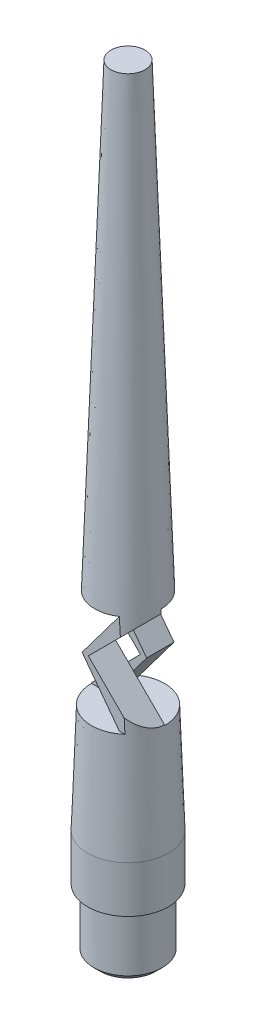
ISO-10303-21;
HEADER;
FILE_DESCRIPTION(('STEP AP214'),'2;1');
FILE_NAME('part.step','',(''),(''),'','','');
FILE_SCHEMA(('AUTOMOTIVE_DESIGN { 1 0 10303 214 1 1 1 1 }'));
ENDSEC;
DATA;
#1=APPLICATION_CONTEXT('core data for automotive mechanical design processes');
#2=APPLICATION_PROTOCOL_DEFINITION('international standard','automotive_design',2000,#1);
#3=PRODUCT_CONTEXT('',#1,'mechanical');
#4=PRODUCT('Part','Part','',(#3));
#5=PRODUCT_RELATED_PRODUCT_CATEGORY('part','',(#4));
#6=PRODUCT_DEFINITION_FORMATION('','',#4);
#7=PRODUCT_DEFINITION_CONTEXT('part definition',#1,'design');
#8=PRODUCT_DEFINITION('design','',#6,#7);
#9=PRODUCT_DEFINITION_SHAPE('','',#8);
#10=(LENGTH_UNIT() NAMED_UNIT(*) SI_UNIT(.MILLI.,.METRE.));
#11=(NAMED_UNIT(*) PLANE_ANGLE_UNIT() SI_UNIT($,.RADIAN.));
#12=(NAMED_UNIT(*) SI_UNIT($,.STERADIAN.) SOLID_ANGLE_UNIT());
#13=UNCERTAINTY_MEASURE_WITH_UNIT(LENGTH_MEASURE(1.E-05),#10,'distance_accuracy_value','');
#14=(GEOMETRIC_REPRESENTATION_CONTEXT(3) GLOBAL_UNCERTAINTY_ASSIGNED_CONTEXT((#13)) GLOBAL_UNIT_ASSIGNED_CONTEXT((#10,
#11,#12)) REPRESENTATION_CONTEXT('',''));
#15=CARTESIAN_POINT('',(0.,0.,0.));
#16=DIRECTION('',(0.,0.,1.));
#17=DIRECTION('',(1.,0.,0.));
#18=AXIS2_PLACEMENT_3D('',#15,#16,#17);
#19=CARTESIAN_POINT('',(0.,31.75,0.));
#20=DIRECTION('',(0.,-1.,0.));
#21=DIRECTION('',(0.,0.,-1.));
#22=AXIS2_PLACEMENT_3D('',#19,#20,#21);
#23=CONICAL_SURFACE('',#22,0.697488389028024,0.0349065850398794);
#24=CARTESIAN_POINT('',(0.,31.75,0.));
#25=DIRECTION('',(0.,-1.,0.));
#26=DIRECTION('',(0.,0.,-1.));
#27=AXIS2_PLACEMENT_3D('',#24,#25,#26);
#28=CIRCLE('',#27,0.697488389028024);
#29=CARTESIAN_POINT('',(0.,31.75,-0.697488389028024));
#30=VERTEX_POINT('',#29);
#31=EDGE_CURVE('E278',#30,#30,#28,.T.);
#32=ORIENTED_EDGE('',*,*,#31,.T.);
#33=EDGE_LOOP('',(#32));
#34=FACE_BOUND('',#33,.T.);
#35=CARTESIAN_POINT('',(0.,12.954,0.));
#36=DIRECTION('',(0.,-1.,0.));
#37=DIRECTION('',(0.,0.,-1.));
#38=AXIS2_PLACEMENT_3D('',#35,#36,#37);
#39=CIRCLE('',#38,1.35385917239478);
#40=CARTESIAN_POINT('',(0.762000000000001,12.954,1.11905793356621));
#41=VERTEX_POINT('',#40);
#42=CARTESIAN_POINT('',(-1.35385917239478,12.954,0.));
#43=VERTEX_POINT('',#42);
#44=EDGE_CURVE('E225',#41,#43,#39,.T.);
#45=ORIENTED_EDGE('',*,*,#44,.F.);
#46=CARTESIAN_POINT('',(0.344874877952984,18.1905441445344,1.11905793356621));
#47=CARTESIAN_POINT('',(0.366958544449909,18.0031584611561,1.11905793356621));
#48=CARTESIAN_POINT('',(0.387398118245948,17.8155923125749,1.11905793356621));
#49=CARTESIAN_POINT('',(0.42584101998219,17.4402219025642,1.11905793356621));
#50=CARTESIAN_POINT('',(0.443844518155292,17.2524176586995,1.11905793356621));
#51=CARTESIAN_POINT('',(0.478267607960336,16.876694379567,1.11905793356621));
#52=CARTESIAN_POINT('',(0.494687424638667,16.6887753644393,1.11905793356621));
#53=CARTESIAN_POINT('',(0.526320720234131,16.3128319408889,1.11905793356621));
#54=CARTESIAN_POINT('',(0.541534173138758,16.1248075302817,1.11905793356621));
#55=CARTESIAN_POINT('',(0.585793394830816,15.5607053414625,1.11905793356621));
#56=CARTESIAN_POINT('',(0.613464948922903,15.1845201878882,1.11905793356621));
#57=CARTESIAN_POINT('',(0.666389895787681,14.4319788791448,1.11905793356621));
#58=CARTESIAN_POINT('',(0.691643263103022,14.0556227222173,1.11905793356621));
#59=CARTESIAN_POINT('',(0.764832744086864,12.9263762905078,1.11905793356621));
#60=CARTESIAN_POINT('',(0.810197352628553,12.1733200086721,1.11905793356621));
#61=CARTESIAN_POINT('',(0.896911706351542,10.6668132135326,1.11905793356621));
#62=CARTESIAN_POINT('',(0.938260551200127,9.91336264972423,1.11905793356621));
#63=CARTESIAN_POINT('',(1.0182235832761,8.40632670747257,1.11905793356621));
#64=CARTESIAN_POINT('',(1.05683780652201,7.65274133093604,1.11905793356621));
#65=CARTESIAN_POINT('',(1.12149035379968,6.35816205277833,1.11905793356621));
#66=CARTESIAN_POINT('',(1.14800232634399,5.81719158421128,1.11905793356621));
#67=CARTESIAN_POINT('',(1.20019110216305,4.73530442626573,1.11905793356621));
#68=CARTESIAN_POINT('',(1.22586804958962,4.19438774384877,1.11905793356621));
#69=CARTESIAN_POINT('',(1.251217830023,3.65345585546555,1.11905793356621));
#70=B_SPLINE_CURVE_WITH_KNOTS('',3,(#46,#47,#48,#49,#50,#51,#52,#53,#54,#55,#56,#57,#58,#59,#60,
#61,#62,#63,#64,#65,#66,#67,#68,#69),.UNSPECIFIED.,.F.,.F.,(4,2,2,2,2,2,2,2,2,2,2,4),(0.,
0.566021473602828,1.13200337319081,1.69790472600926,2.26381827789418,3.39540922411778,
4.52701208180383,6.79025375515423,9.05400168070206,11.317719784199,12.9425784477041,
14.5671551037747),.UNSPECIFIED.);
#71=CARTESIAN_POINT('',(0.805723416903883,12.2357234169039,1.11905793356621));
#72=VERTEX_POINT('',#71);
#73=EDGE_CURVE('E182',#41,#72,#70,.T.);
#74=ORIENTED_EDGE('',*,*,#73,.T.);
#75=CARTESIAN_POINT('',(-0.0491962542108655,11.3808037457891,0.));
#76=DIRECTION('',(0.707106781186547,-0.707106781186548,0.));
#77=DIRECTION('',(-0.707106781186548,-0.707106781186547,0.));
#78=AXIS2_PLACEMENT_3D('',#75,#76,#77);
#79=ELLIPSE('',#78,1.9923389700624,1.40793714859232);
#80=CARTESIAN_POINT('',(1.35960014194249,12.7896001419425,0.));
#81=VERTEX_POINT('',#80);
#82=EDGE_CURVE('E221',#81,#72,#79,.T.);
#83=ORIENTED_EDGE('',*,*,#82,.F.);
#84=DIRECTION('',(0.0348994967024938,-0.999390827019096,0.));
#85=VECTOR('',#84,1.);
#86=CARTESIAN_POINT('',(0.,51.7234541701034,0.));
#87=LINE('',#86,#85);
#88=CARTESIAN_POINT('',(1.35385917239478,12.954,0.));
#89=VERTEX_POINT('',#88);
#90=EDGE_CURVE('E293',#89,#81,#87,.T.);
#91=ORIENTED_EDGE('',*,*,#90,.F.);
#92=CARTESIAN_POINT('',(0.,12.954,0.));
#93=DIRECTION('',(0.,1.,0.));
#94=DIRECTION('',(0.,0.,1.));
#95=AXIS2_PLACEMENT_3D('',#92,#93,#94);
#96=CIRCLE('',#95,1.35385917239478);
#97=CARTESIAN_POINT('',(-0.762,12.954,-1.11905793356621));
#98=VERTEX_POINT('',#97);
#99=EDGE_CURVE('E298',#89,#98,#96,.T.);
#100=ORIENTED_EDGE('',*,*,#99,.T.);
#101=CARTESIAN_POINT('',(-0.344874877952984,18.1905441445344,-1.11905793356621));
#102=CARTESIAN_POINT('',(-0.36695854444991,18.0031584611561,-1.11905793356621));
#103=CARTESIAN_POINT('',(-0.387398118245948,17.8155923125749,-1.11905793356621));
#104=CARTESIAN_POINT('',(-0.42584101998219,17.4402219025642,-1.11905793356621));
#105=CARTESIAN_POINT('',(-0.443844518155292,17.2524176586995,-1.11905793356621));
#106=CARTESIAN_POINT('',(-0.478267607960336,16.876694379567,-1.11905793356621));
#107=CARTESIAN_POINT('',(-0.494687424638668,16.6887753644393,-1.11905793356621));
#108=CARTESIAN_POINT('',(-0.526320720234132,16.3128319408889,-1.11905793356621));
#109=CARTESIAN_POINT('',(-0.541534173138758,16.1248075302817,-1.11905793356621));
#110=CARTESIAN_POINT('',(-0.585793394830816,15.5607053414625,-1.11905793356621));
#111=CARTESIAN_POINT('',(-0.613464948922903,15.1845201878882,-1.11905793356621));
#112=CARTESIAN_POINT('',(-0.666389895787681,14.4319788791448,-1.11905793356621));
#113=CARTESIAN_POINT('',(-0.691643263103022,14.0556227222173,-1.11905793356621));
#114=CARTESIAN_POINT('',(-0.764832744086863,12.9263762905078,-1.11905793356621));
#115=CARTESIAN_POINT('',(-0.810197352628553,12.1733200086721,-1.11905793356621));
#116=CARTESIAN_POINT('',(-0.896911706351542,10.6668132135326,-1.11905793356621));
#117=CARTESIAN_POINT('',(-0.938260551200127,9.91336264972423,-1.11905793356621));
#118=CARTESIAN_POINT('',(-1.0182235832761,8.40632670747258,-1.11905793356621));
#119=CARTESIAN_POINT('',(-1.05683780652201,7.65274133093604,-1.11905793356621));
#120=CARTESIAN_POINT('',(-1.12149035379968,6.35816205277833,-1.11905793356621));
#121=CARTESIAN_POINT('',(-1.14800232634399,5.81719158421128,-1.11905793356621));
#122=CARTESIAN_POINT('',(-1.20019110216305,4.73530442626574,-1.11905793356621));
#123=CARTESIAN_POINT('',(-1.22586804958962,4.19438774384878,-1.11905793356621));
#124=CARTESIAN_POINT('',(-1.251217830023,3.65345585546556,-1.11905793356621));
#125=B_SPLINE_CURVE_WITH_KNOTS('',3,(#101,#102,#103,#104,#105,#106,#107,#108,#109,#110,#111,
#112,#113,#114,#115,#116,#117,#118,#119,#120,#121,#122,#123,#124),.UNSPECIFIED.,.F.,.F.,(4,2,2,
2,2,2,2,2,2,2,2,4),(0.,0.566021473602828,1.13200337319081,1.69790472600926,2.26381827789418,
3.39540922411778,4.52701208180383,6.79025375515423,9.05400168070206,11.317719784199,
12.9425784477041,14.5671551037746),.UNSPECIFIED.);
#126=CARTESIAN_POINT('',(-0.805723416903883,12.2357234169039,-1.11905793356621));
#127=VERTEX_POINT('',#126);
#128=EDGE_CURVE('E354',#98,#127,#125,.T.);
#129=ORIENTED_EDGE('',*,*,#128,.T.);
#130=CARTESIAN_POINT('',(0.0491962542108655,11.3808037457891,0.));
#131=DIRECTION('',(0.707106781186547,0.707106781186548,0.));
#132=DIRECTION('',(0.707106781186548,-0.707106781186547,0.));
#133=AXIS2_PLACEMENT_3D('',#130,#131,#132);
#134=ELLIPSE('',#133,1.9923389700624,1.40793714859232);
#135=CARTESIAN_POINT('',(-1.35960014194248,12.7896001419425,0.));
#136=VERTEX_POINT('',#135);
#137=EDGE_CURVE('E290',#127,#136,#134,.T.);
#138=ORIENTED_EDGE('',*,*,#137,.T.);
#139=DIRECTION('',(0.0348994967024938,0.999390827019096,0.));
#140=VECTOR('',#139,1.);
#141=CARTESIAN_POINT('',(0.,51.7234541701034,0.));
#142=LINE('',#141,#140);
#143=EDGE_CURVE('E235',#136,#43,#142,.T.);
#144=ORIENTED_EDGE('',*,*,#143,.T.);
#145=EDGE_LOOP('',(#45,#74,#83,#91,#100,#129,#138,#144));
#146=FACE_BOUND('',#145,.T.);
#147=ADVANCED_FACE('F41',(#34,#146),#23,.T.);
#148=CARTESIAN_POINT('',(0.,4.445,0.));
#149=DIRECTION('',(0.,-1.,0.));
#150=DIRECTION('',(0.,0.,-1.));
#151=AXIS2_PLACEMENT_3D('',#148,#149,#150);
#152=CIRCLE('',#151,1.651);
#153=CARTESIAN_POINT('',(0.,4.445,-1.651));
#154=VERTEX_POINT('',#153);
#155=EDGE_CURVE('E275',#154,#154,#152,.T.);
#156=ORIENTED_EDGE('',*,*,#155,.F.);
#157=EDGE_LOOP('',(#156));
#158=FACE_BOUND('',#157,.T.);
#159=CARTESIAN_POINT('',(0.0504367384360997,10.3635632615639,0.));
#160=DIRECTION('',(0.707106781186548,0.707106781186547,0.));
#161=DIRECTION('',(0.707106781186547,-0.707106781186548,0.));
#162=AXIS2_PLACEMENT_3D('',#159,#160,#161);
#163=ELLIPSE('',#162,2.042575824541,1.44343830312057);
#164=CARTESIAN_POINT('',(0.96270772764048,9.45129227235952,1.11905793356621));
#165=VERTEX_POINT('',#164);
#166=CARTESIAN_POINT('',(1.49475595505674,8.91924404494326,0.));
#167=VERTEX_POINT('',#166);
#168=EDGE_CURVE('E219',#165,#167,#163,.T.);
#169=ORIENTED_EDGE('',*,*,#168,.F.);
#170=CARTESIAN_POINT('',(0.992501240483968,8.89,1.11905793356621));
#171=VERTEX_POINT('',#170);
#172=EDGE_CURVE('E449',#165,#171,#70,.T.);
#173=ORIENTED_EDGE('',*,*,#172,.T.);
#174=CARTESIAN_POINT('',(0.,8.89,0.));
#175=DIRECTION('',(0.,1.,0.));
#176=DIRECTION('',(0.,0.,1.));
#177=AXIS2_PLACEMENT_3D('',#174,#175,#176);
#178=CIRCLE('',#177,1.49577717960921);
#179=CARTESIAN_POINT('',(-1.49577717960921,8.89,0.));
#180=VERTEX_POINT('',#179);
#181=EDGE_CURVE('E191',#180,#171,#178,.T.);
#182=ORIENTED_EDGE('',*,*,#181,.F.);
#183=CARTESIAN_POINT('',(-1.49475595505675,8.91924404494325,0.));
#184=VERTEX_POINT('',#183);
#185=EDGE_CURVE('E231',#180,#184,#142,.T.);
#186=ORIENTED_EDGE('',*,*,#185,.T.);
#187=CARTESIAN_POINT('',(-0.0504367384360962,10.3635632615639,0.));
#188=DIRECTION('',(0.707106781186548,-0.707106781186547,0.));
#189=DIRECTION('',(-0.707106781186547,-0.707106781186548,0.));
#190=AXIS2_PLACEMENT_3D('',#187,#188,#189);
#191=ELLIPSE('',#190,2.042575824541,1.44343830312057);
#192=CARTESIAN_POINT('',(-0.962707727640477,9.45129227235952,-1.11905793356621));
#193=VERTEX_POINT('',#192);
#194=EDGE_CURVE('E287',#184,#193,#191,.T.);
#195=ORIENTED_EDGE('',*,*,#194,.T.);
#196=CARTESIAN_POINT('',(-0.992501240483968,8.89,-1.11905793356621));
#197=VERTEX_POINT('',#196);
#198=EDGE_CURVE('E350',#193,#197,#125,.T.);
#199=ORIENTED_EDGE('',*,*,#198,.T.);
#200=CARTESIAN_POINT('',(0.,8.89,0.));
#201=DIRECTION('',(0.,-1.,0.));
#202=DIRECTION('',(0.,0.,-1.));
#203=AXIS2_PLACEMENT_3D('',#200,#201,#202);
#204=CIRCLE('',#203,1.49577717960921);
#205=CARTESIAN_POINT('',(1.49577717960921,8.89,0.));
#206=VERTEX_POINT('',#205);
#207=EDGE_CURVE('E296',#197,#206,#204,.T.);
#208=ORIENTED_EDGE('',*,*,#207,.T.);
#209=EDGE_CURVE('E292',#167,#206,#87,.T.);
#210=ORIENTED_EDGE('',*,*,#209,.F.);
#211=EDGE_LOOP('',(#169,#173,#182,#186,#195,#199,#208,#210));
#212=FACE_BOUND('',#211,.T.);
#213=ADVANCED_FACE('F363',(#158,#212),#23,.T.);
#214=CARTESIAN_POINT('',(0.,0.,0.));
#215=DIRECTION('',(0.,0.,-1.));
#216=DIRECTION('',(-1.,0.,0.));
#217=AXIS2_PLACEMENT_3D('',#214,#215,#216);
#218=PLANE('',#217);
#219=DIRECTION('',(0.707106781186547,0.707106781186548,0.));
#220=VECTOR('',#219,1.);
#221=CARTESIAN_POINT('',(0.507999999999999,10.922,0.));
#222=LINE('',#221,#220);
#223=CARTESIAN_POINT('',(-0.217714285714285,10.1962857142857,0.));
#224=VERTEX_POINT('',#223);
#225=CARTESIAN_POINT('',(0.,10.414,0.));
#226=VERTEX_POINT('',#225);
#227=EDGE_CURVE('E256',#224,#226,#222,.T.);
#228=ORIENTED_EDGE('',*,*,#227,.F.);
#229=DIRECTION('',(-0.6,0.8,0.));
#230=VECTOR('',#229,1.);
#231=CARTESIAN_POINT('',(-0.761999999999999,10.922,0.));
#232=LINE('',#231,#230);
#233=CARTESIAN_POINT('',(-0.761999999999999,10.922,0.));
#234=VERTEX_POINT('',#233);
#235=EDGE_CURVE('E345',#224,#234,#232,.T.);
#236=ORIENTED_EDGE('',*,*,#235,.T.);
#237=DIRECTION('',(0.6,0.8,0.));
#238=VECTOR('',#237,1.);
#239=CARTESIAN_POINT('',(0.762000000000001,12.954,0.));
#240=LINE('',#239,#238);
#241=CARTESIAN_POINT('',(-0.217714285714286,11.6477142857143,0.));
#242=VERTEX_POINT('',#241);
#243=EDGE_CURVE('E341',#234,#242,#240,.T.);
#244=ORIENTED_EDGE('',*,*,#243,.T.);
#245=DIRECTION('',(-0.707106781186548,0.707106781186547,0.));
#246=VECTOR('',#245,1.);
#247=CARTESIAN_POINT('',(-1.778,13.208,0.));
#248=LINE('',#247,#246);
#249=CARTESIAN_POINT('',(0.,11.43,0.));
#250=VERTEX_POINT('',#249);
#251=EDGE_CURVE('E263',#250,#242,#248,.T.);
#252=ORIENTED_EDGE('',*,*,#251,.F.);
#253=DIRECTION('',(-0.707106781186548,-0.707106781186547,0.));
#254=VECTOR('',#253,1.);
#255=CARTESIAN_POINT('',(-0.507999999999999,10.922,0.));
#256=LINE('',#255,#254);
#257=CARTESIAN_POINT('',(-0.507999999999999,10.922,0.));
#258=VERTEX_POINT('',#257);
#259=EDGE_CURVE('E210',#250,#258,#256,.T.);
#260=ORIENTED_EDGE('',*,*,#259,.T.);
#261=DIRECTION('',(0.707106781186547,-0.707106781186548,0.));
#262=VECTOR('',#261,1.);
#263=CARTESIAN_POINT('',(1.778,8.636,0.));
#264=LINE('',#263,#262);
#265=EDGE_CURVE('E214',#258,#226,#264,.T.);
#266=ORIENTED_EDGE('',*,*,#265,.T.);
#267=EDGE_LOOP('',(#228,#236,#244,#252,#260,#266));
#268=FACE_BOUND('',#267,.T.);
#269=ADVANCED_FACE('F396',(#268),#218,.T.);
#270=CARTESIAN_POINT('',(0.,0.,0.));
#271=DIRECTION('',(0.,0.,-1.));
#272=DIRECTION('',(-1.,0.,0.));
#273=AXIS2_PLACEMENT_3D('',#270,#271,#272);
#274=PLANE('',#273);
#275=DIRECTION('',(1.,0.,0.));
#276=VECTOR('',#275,1.);
#277=CARTESIAN_POINT('',(2.54,8.89,0.));
#278=LINE('',#277,#276);
#279=CARTESIAN_POINT('',(0.762000000000001,8.89,0.));
#280=VERTEX_POINT('',#279);
#281=EDGE_CURVE('E246',#280,#206,#278,.T.);
#282=ORIENTED_EDGE('',*,*,#281,.F.);
#283=CARTESIAN_POINT('',(0.,9.906,0.));
#284=VERTEX_POINT('',#283);
#285=EDGE_CURVE('E197',#280,#284,#232,.T.);
#286=ORIENTED_EDGE('',*,*,#285,.T.);
#287=DIRECTION('',(-0.6,-0.8,0.));
#288=VECTOR('',#287,1.);
#289=CARTESIAN_POINT('',(-0.762000000000001,8.89,0.));
#290=LINE('',#289,#288);
#291=CARTESIAN_POINT('',(0.217714285714285,10.1962857142857,0.));
#292=VERTEX_POINT('',#291);
#293=EDGE_CURVE('E247',#292,#284,#290,.T.);
#294=ORIENTED_EDGE('',*,*,#293,.F.);
#295=DIRECTION('',(0.707106781186547,-0.707106781186548,0.));
#296=VECTOR('',#295,1.);
#297=CARTESIAN_POINT('',(5.207,5.20699999999999,0.));
#298=LINE('',#297,#296);
#299=EDGE_CURVE('E300',#292,#167,#298,.T.);
#300=ORIENTED_EDGE('',*,*,#299,.T.);
#301=ORIENTED_EDGE('',*,*,#209,.T.);
#302=EDGE_LOOP('',(#282,#286,#294,#300,#301));
#303=FACE_BOUND('',#302,.T.);
#304=ADVANCED_FACE('F393',(#303),#274,.T.);
#305=DIRECTION('',(0.6,-0.8,0.));
#306=VECTOR('',#305,1.);
#307=CARTESIAN_POINT('',(0.761999999999999,10.922,0.));
#308=LINE('',#307,#306);
#309=CARTESIAN_POINT('',(0.,11.938,0.));
#310=VERTEX_POINT('',#309);
#311=CARTESIAN_POINT('',(0.217714285714287,11.6477142857143,0.));
#312=VERTEX_POINT('',#311);
#313=EDGE_CURVE('E242',#310,#312,#308,.T.);
#314=ORIENTED_EDGE('',*,*,#313,.F.);
#315=DIRECTION('',(0.6,0.8,0.));
#316=VECTOR('',#315,1.);
#317=CARTESIAN_POINT('',(-5.73024,4.29767999999999,0.));
#318=LINE('',#317,#316);
#319=CARTESIAN_POINT('',(0.762000000000001,12.954,0.));
#320=VERTEX_POINT('',#319);
#321=EDGE_CURVE('E306',#310,#320,#318,.T.);
#322=ORIENTED_EDGE('',*,*,#321,.T.);
#323=DIRECTION('',(-1.,0.,0.));
#324=VECTOR('',#323,1.);
#325=CARTESIAN_POINT('',(-0.762000000000001,12.954,0.));
#326=LINE('',#325,#324);
#327=EDGE_CURVE('E249',#89,#320,#326,.T.);
#328=ORIENTED_EDGE('',*,*,#327,.F.);
#329=ORIENTED_EDGE('',*,*,#90,.T.);
#330=DIRECTION('',(-0.707106781186548,-0.707106781186547,0.));
#331=VECTOR('',#330,1.);
#332=CARTESIAN_POINT('',(-5.715,5.71500000000001,0.));
#333=LINE('',#332,#331);
#334=EDGE_CURVE('E303',#81,#312,#333,.T.);
#335=ORIENTED_EDGE('',*,*,#334,.T.);
#336=EDGE_LOOP('',(#314,#322,#328,#329,#335));
#337=FACE_BOUND('',#336,.T.);
#338=ADVANCED_FACE('F310',(#337),#274,.T.);
#339=CARTESIAN_POINT('',(-1.397,0.,0.));
#340=DIRECTION('',(0.,1.,0.));
#341=DIRECTION('',(0.,0.,1.));
#342=AXIS2_PLACEMENT_3D('',#339,#340,#341);
#343=PLANE('',#342);
#344=CARTESIAN_POINT('',(0.,0.,0.));
#345=DIRECTION('',(0.,1.,0.));
#346=DIRECTION('',(0.,0.,1.));
#347=AXIS2_PLACEMENT_3D('',#344,#345,#346);
#348=CIRCLE('',#347,1.143);
#349=CARTESIAN_POINT('',(0.,0.,1.143));
#350=VERTEX_POINT('',#349);
#351=EDGE_CURVE('E281',#350,#350,#348,.F.);
#352=ORIENTED_EDGE('',*,*,#351,.T.);
#353=EDGE_LOOP('',(#352));
#354=FACE_BOUND('',#353,.T.);
#355=ADVANCED_FACE('F432',(#354),#343,.F.);
#356=CARTESIAN_POINT('',(0.,31.75,0.));
#357=DIRECTION('',(0.,-1.,0.));
#358=DIRECTION('',(0.,0.,-1.));
#359=AXIS2_PLACEMENT_3D('',#356,#357,#358);
#360=PLANE('',#359);
#361=ORIENTED_EDGE('',*,*,#31,.F.);
#362=EDGE_LOOP('',(#361));
#363=FACE_BOUND('',#362,.T.);
#364=ADVANCED_FACE('F427',(#363),#360,.F.);
#365=CARTESIAN_POINT('',(0.,0.,0.));
#366=DIRECTION('',(0.,-1.,0.));
#367=DIRECTION('',(0.,0.,-1.));
#368=AXIS2_PLACEMENT_3D('',#365,#366,#367);
#369=CYLINDRICAL_SURFACE('',#368,1.651);
#370=CARTESIAN_POINT('',(0.,2.54,0.));
#371=DIRECTION('',(0.,-1.,0.));
#372=DIRECTION('',(0.,0.,-1.));
#373=AXIS2_PLACEMENT_3D('',#370,#371,#372);
#374=CIRCLE('',#373,1.651);
#375=CARTESIAN_POINT('',(0.,2.54,-1.651));
#376=VERTEX_POINT('',#375);
#377=EDGE_CURVE('E272',#376,#376,#374,.T.);
#378=ORIENTED_EDGE('',*,*,#377,.F.);
#379=EDGE_LOOP('',(#378));
#380=FACE_BOUND('',#379,.T.);
#381=ORIENTED_EDGE('',*,*,#155,.T.);
#382=EDGE_LOOP('',(#381));
#383=FACE_BOUND('',#382,.T.);
#384=ADVANCED_FACE('F424',(#380,#383),#369,.T.);
#385=CARTESIAN_POINT('',(-1.651,2.54,0.));
#386=DIRECTION('',(0.,1.,0.));
#387=DIRECTION('',(0.,0.,1.));
#388=AXIS2_PLACEMENT_3D('',#385,#386,#387);
#389=PLANE('',#388);
#390=CARTESIAN_POINT('',(0.,2.54,0.));
#391=DIRECTION('',(0.,-1.,0.));
#392=DIRECTION('',(0.,0.,-1.));
#393=AXIS2_PLACEMENT_3D('',#390,#391,#392);
#394=CIRCLE('',#393,1.397);
#395=CARTESIAN_POINT('',(0.,2.54,-1.397));
#396=VERTEX_POINT('',#395);
#397=EDGE_CURVE('E269',#396,#396,#394,.T.);
#398=ORIENTED_EDGE('',*,*,#397,.F.);
#399=EDGE_LOOP('',(#398));
#400=FACE_BOUND('',#399,.T.);
#401=ORIENTED_EDGE('',*,*,#377,.T.);
#402=EDGE_LOOP('',(#401));
#403=FACE_BOUND('',#402,.T.);
#404=ADVANCED_FACE('F421',(#400,#403),#389,.F.);
#405=CARTESIAN_POINT('',(0.,0.,0.));
#406=DIRECTION('',(0.,-1.,0.));
#407=DIRECTION('',(0.,0.,-1.));
#408=AXIS2_PLACEMENT_3D('',#405,#406,#407);
#409=CYLINDRICAL_SURFACE('',#408,1.397);
#410=CARTESIAN_POINT('',(0.,0.253999999999999,0.));
#411=DIRECTION('',(0.,1.,0.));
#412=DIRECTION('',(0.,0.,1.));
#413=AXIS2_PLACEMENT_3D('',#410,#411,#412);
#414=CIRCLE('',#413,1.397);
#415=CARTESIAN_POINT('',(0.,0.253999999999999,1.397));
#416=VERTEX_POINT('',#415);
#417=EDGE_CURVE('E284',#416,#416,#414,.T.);
#418=ORIENTED_EDGE('',*,*,#417,.T.);
#419=EDGE_LOOP('',(#418));
#420=FACE_BOUND('',#419,.T.);
#421=ORIENTED_EDGE('',*,*,#397,.T.);
#422=EDGE_LOOP('',(#421));
#423=FACE_BOUND('',#422,.T.);
#424=ADVANCED_FACE('F418',(#420,#423),#409,.T.);
#425=CARTESIAN_POINT('',(0.,0.,0.));
#426=DIRECTION('',(0.,1.,0.));
#427=DIRECTION('',(0.,0.,1.));
#428=AXIS2_PLACEMENT_3D('',#425,#426,#427);
#429=CONICAL_SURFACE('',#428,1.143,0.785398163397446);
#430=ORIENTED_EDGE('',*,*,#417,.F.);
#431=EDGE_LOOP('',(#430));
#432=FACE_BOUND('',#431,.T.);
#433=ORIENTED_EDGE('',*,*,#351,.F.);
#434=EDGE_LOOP('',(#433));
#435=FACE_BOUND('',#434,.T.);
#436=ADVANCED_FACE('F43',(#432,#435),#429,.T.);
#437=CARTESIAN_POINT('',(-1.778,13.208,-2.54));
#438=DIRECTION('',(0.707106781186547,0.707106781186548,0.));
#439=DIRECTION('',(-0.707106781186548,0.707106781186547,0.));
#440=AXIS2_PLACEMENT_3D('',#437,#438,#439);
#441=PLANE('',#440);
#442=ORIENTED_EDGE('',*,*,#137,.F.);
#443=DIRECTION('',(0.707106781186548,-0.707106781186547,0.));
#444=VECTOR('',#443,1.);
#445=CARTESIAN_POINT('',(-1.778,13.208,-1.11905793356621));
#446=LINE('',#445,#444);
#447=CARTESIAN_POINT('',(0.507999999999998,10.922,-1.11905793356621));
#448=VERTEX_POINT('',#447);
#449=EDGE_CURVE('E351',#127,#448,#446,.T.);
#450=ORIENTED_EDGE('',*,*,#449,.T.);
#451=DIRECTION('',(0.,0.,1.));
#452=VECTOR('',#451,1.);
#453=CARTESIAN_POINT('',(0.507999999999999,10.922,-2.54));
#454=LINE('',#453,#452);
#455=CARTESIAN_POINT('',(0.507999999999998,10.922,0.));
#456=VERTEX_POINT('',#455);
#457=EDGE_CURVE('E267',#448,#456,#454,.T.);
#458=ORIENTED_EDGE('',*,*,#457,.T.);
#459=EDGE_CURVE('E264',#456,#250,#248,.T.);
#460=ORIENTED_EDGE('',*,*,#459,.T.);
#461=ORIENTED_EDGE('',*,*,#251,.T.);
#462=DIRECTION('',(-0.707106781186548,0.707106781186547,0.));
#463=VECTOR('',#462,1.);
#464=CARTESIAN_POINT('',(-1.778,13.208,0.));
#465=LINE('',#464,#463);
#466=EDGE_CURVE('E230',#242,#136,#465,.T.);
#467=ORIENTED_EDGE('',*,*,#466,.T.);
#468=EDGE_LOOP('',(#442,#450,#458,#460,#461,#467));
#469=FACE_BOUND('',#468,.T.);
#470=ADVANCED_FACE('F411',(#469),#441,.F.);
#471=CARTESIAN_POINT('',(0.507999999999999,10.922,-2.54));
#472=DIRECTION('',(0.707106781186548,-0.707106781186547,0.));
#473=DIRECTION('',(0.707106781186547,0.707106781186548,0.));
#474=AXIS2_PLACEMENT_3D('',#471,#472,#473);
#475=PLANE('',#474);
#476=ORIENTED_EDGE('',*,*,#457,.F.);
#477=DIRECTION('',(-0.707106781186547,-0.707106781186548,0.));
#478=VECTOR('',#477,1.);
#479=CARTESIAN_POINT('',(0.507999999999999,10.922,-1.11905793356621));
#480=LINE('',#479,#478);
#481=EDGE_CURVE('E347',#448,#193,#480,.T.);
#482=ORIENTED_EDGE('',*,*,#481,.T.);
#483=ORIENTED_EDGE('',*,*,#194,.F.);
#484=EDGE_CURVE('E260',#184,#224,#222,.T.);
#485=ORIENTED_EDGE('',*,*,#484,.T.);
#486=ORIENTED_EDGE('',*,*,#227,.T.);
#487=DIRECTION('',(0.707106781186547,0.707106781186548,0.));
#488=VECTOR('',#487,1.);
#489=CARTESIAN_POINT('',(0.507999999999999,10.922,0.));
#490=LINE('',#489,#488);
#491=EDGE_CURVE('E227',#226,#456,#490,.T.);
#492=ORIENTED_EDGE('',*,*,#491,.T.);
#493=EDGE_LOOP('',(#476,#482,#483,#485,#486,#492));
#494=FACE_BOUND('',#493,.T.);
#495=ADVANCED_FACE('F407',(#494),#475,.F.);
#496=CARTESIAN_POINT('',(0.761999999999999,10.922,-2.54));
#497=DIRECTION('',(-0.8,-0.6,0.));
#498=DIRECTION('',(0.6,-0.8,0.));
#499=AXIS2_PLACEMENT_3D('',#496,#497,#498);
#500=PLANE('',#499);
#501=DIRECTION('',(0.,0.,1.));
#502=VECTOR('',#501,1.);
#503=CARTESIAN_POINT('',(0.761999999999999,10.922,-2.54));
#504=LINE('',#503,#502);
#505=CARTESIAN_POINT('',(0.761999999999999,10.922,-1.11905793356621));
#506=VERTEX_POINT('',#505);
#507=CARTESIAN_POINT('',(0.761999999999998,10.922,0.));
#508=VERTEX_POINT('',#507);
#509=EDGE_CURVE('E252',#506,#508,#504,.T.);
#510=ORIENTED_EDGE('',*,*,#509,.F.);
#511=DIRECTION('',(-0.6,0.8,0.));
#512=VECTOR('',#511,1.);
#513=CARTESIAN_POINT('',(0.761999999999999,10.922,-1.11905793356621));
#514=LINE('',#513,#512);
#515=EDGE_CURVE('E56',#506,#98,#514,.T.);
#516=ORIENTED_EDGE('',*,*,#515,.T.);
#517=DIRECTION('',(0.,0.,1.));
#518=VECTOR('',#517,1.);
#519=CARTESIAN_POINT('',(-0.762000000000001,12.954,-2.54));
#520=LINE('',#519,#518);
#521=CARTESIAN_POINT('',(-0.762000000000001,12.954,0.));
#522=VERTEX_POINT('',#521);
#523=EDGE_CURVE('E253',#98,#522,#520,.T.);
#524=ORIENTED_EDGE('',*,*,#523,.T.);
#525=EDGE_CURVE('E238',#522,#310,#308,.T.);
#526=ORIENTED_EDGE('',*,*,#525,.T.);
#527=ORIENTED_EDGE('',*,*,#313,.T.);
#528=EDGE_CURVE('E234',#312,#508,#308,.T.);
#529=ORIENTED_EDGE('',*,*,#528,.T.);
#530=EDGE_LOOP('',(#510,#516,#524,#526,#527,#529));
#531=FACE_BOUND('',#530,.T.);
#532=ADVANCED_FACE('F330',(#531),#500,.F.);
#533=CARTESIAN_POINT('',(-0.762000000000001,12.954,-2.54));
#534=DIRECTION('',(0.,1.,0.));
#535=DIRECTION('',(0.,0.,1.));
#536=AXIS2_PLACEMENT_3D('',#533,#534,#535);
#537=PLANE('',#536);
#538=DIRECTION('',(0.,0.,-1.));
#539=VECTOR('',#538,1.);
#540=CARTESIAN_POINT('',(0.762000000000001,12.954,1.651));
#541=LINE('',#540,#539);
#542=EDGE_CURVE('E199',#41,#320,#541,.T.);
#543=ORIENTED_EDGE('',*,*,#542,.F.);
#544=ORIENTED_EDGE('',*,*,#44,.T.);
#545=DIRECTION('',(-1.,0.,0.));
#546=VECTOR('',#545,1.);
#547=CARTESIAN_POINT('',(-2.54,12.954,0.));
#548=LINE('',#547,#546);
#549=EDGE_CURVE('E205',#522,#43,#548,.T.);
#550=ORIENTED_EDGE('',*,*,#549,.F.);
#551=ORIENTED_EDGE('',*,*,#523,.F.);
#552=ORIENTED_EDGE('',*,*,#99,.F.);
#553=ORIENTED_EDGE('',*,*,#327,.T.);
#554=EDGE_LOOP('',(#543,#544,#550,#551,#552,#553));
#555=FACE_BOUND('',#554,.T.);
#556=ADVANCED_FACE('F317',(#555),#537,.F.);
#557=CARTESIAN_POINT('',(2.54,8.89,-2.54));
#558=DIRECTION('',(0.,-1.,0.));
#559=DIRECTION('',(0.,0.,-1.));
#560=AXIS2_PLACEMENT_3D('',#557,#558,#559);
#561=PLANE('',#560);
#562=ORIENTED_EDGE('',*,*,#181,.T.);
#563=DIRECTION('',(1.,0.,0.));
#564=VECTOR('',#563,1.);
#565=CARTESIAN_POINT('',(-1.651,8.89,1.11905793356621));
#566=LINE('',#565,#564);
#567=CARTESIAN_POINT('',(0.762000000000004,8.89,1.11905793356621));
#568=VERTEX_POINT('',#567);
#569=EDGE_CURVE('E176',#568,#171,#566,.T.);
#570=ORIENTED_EDGE('',*,*,#569,.F.);
#571=DIRECTION('',(0.,0.,-1.));
#572=VECTOR('',#571,1.);
#573=CARTESIAN_POINT('',(0.762000000000001,8.89,1.651));
#574=LINE('',#573,#572);
#575=EDGE_CURVE('E187',#568,#280,#574,.T.);
#576=ORIENTED_EDGE('',*,*,#575,.T.);
#577=ORIENTED_EDGE('',*,*,#281,.T.);
#578=ORIENTED_EDGE('',*,*,#207,.F.);
#579=DIRECTION('',(1.,0.,0.));
#580=VECTOR('',#579,1.);
#581=CARTESIAN_POINT('',(-1.651,8.89,-1.11905793356621));
#582=LINE('',#581,#580);
#583=CARTESIAN_POINT('',(-0.762000000000004,8.89,-1.11905793356621));
#584=VERTEX_POINT('',#583);
#585=EDGE_CURVE('E192',#197,#584,#582,.T.);
#586=ORIENTED_EDGE('',*,*,#585,.T.);
#587=DIRECTION('',(0.,0.,1.));
#588=VECTOR('',#587,1.);
#589=CARTESIAN_POINT('',(-0.762000000000001,8.89,-2.54));
#590=LINE('',#589,#588);
#591=CARTESIAN_POINT('',(-0.762000000000001,8.89,0.));
#592=VERTEX_POINT('',#591);
#593=EDGE_CURVE('E257',#584,#592,#590,.T.);
#594=ORIENTED_EDGE('',*,*,#593,.T.);
#595=DIRECTION('',(1.,0.,0.));
#596=VECTOR('',#595,1.);
#597=CARTESIAN_POINT('',(0.762000000000001,8.89,0.));
#598=LINE('',#597,#596);
#599=EDGE_CURVE('E200',#180,#592,#598,.T.);
#600=ORIENTED_EDGE('',*,*,#599,.F.);
#601=EDGE_LOOP('',(#562,#570,#576,#577,#578,#586,#594,#600));
#602=FACE_BOUND('',#601,.T.);
#603=ADVANCED_FACE('F185',(#602),#561,.F.);
#604=CARTESIAN_POINT('',(-0.762000000000001,8.89,-2.54));
#605=DIRECTION('',(-0.8,0.6,0.));
#606=DIRECTION('',(-0.6,-0.8,0.));
#607=AXIS2_PLACEMENT_3D('',#604,#605,#606);
#608=PLANE('',#607);
#609=ORIENTED_EDGE('',*,*,#593,.F.);
#610=DIRECTION('',(0.6,0.8,0.));
#611=VECTOR('',#610,1.);
#612=CARTESIAN_POINT('',(-0.762000000000001,8.89,-1.11905793356621));
#613=LINE('',#612,#611);
#614=EDGE_CURVE('E11',#584,#506,#613,.T.);
#615=ORIENTED_EDGE('',*,*,#614,.T.);
#616=ORIENTED_EDGE('',*,*,#509,.T.);
#617=EDGE_CURVE('E243',#508,#292,#290,.T.);
#618=ORIENTED_EDGE('',*,*,#617,.T.);
#619=ORIENTED_EDGE('',*,*,#293,.T.);
#620=EDGE_CURVE('E241',#284,#592,#290,.T.);
#621=ORIENTED_EDGE('',*,*,#620,.T.);
#622=EDGE_LOOP('',(#609,#615,#616,#618,#619,#621));
#623=FACE_BOUND('',#622,.T.);
#624=ADVANCED_FACE('F387',(#623),#608,.F.);
#625=CARTESIAN_POINT('',(0.,0.,0.));
#626=DIRECTION('',(0.,0.,-1.));
#627=DIRECTION('',(-1.,0.,0.));
#628=AXIS2_PLACEMENT_3D('',#625,#626,#627);
#629=PLANE('',#628);
#630=ORIENTED_EDGE('',*,*,#491,.F.);
#631=EDGE_CURVE('E63',#226,#292,#264,.T.);
#632=ORIENTED_EDGE('',*,*,#631,.T.);
#633=ORIENTED_EDGE('',*,*,#617,.F.);
#634=ORIENTED_EDGE('',*,*,#528,.F.);
#635=EDGE_CURVE('E213',#312,#250,#256,.T.);
#636=ORIENTED_EDGE('',*,*,#635,.T.);
#637=ORIENTED_EDGE('',*,*,#459,.F.);
#638=EDGE_LOOP('',(#630,#632,#633,#634,#636,#637));
#639=FACE_BOUND('',#638,.T.);
#640=ADVANCED_FACE('F383',(#639),#629,.F.);
#641=CARTESIAN_POINT('',(-0.507999999999999,10.922,1.651));
#642=DIRECTION('',(0.707106781186547,-0.707106781186548,0.));
#643=DIRECTION('',(0.707106781186548,0.707106781186547,0.));
#644=AXIS2_PLACEMENT_3D('',#641,#642,#643);
#645=PLANE('',#644);
#646=DIRECTION('',(0.707106781186548,0.707106781186547,0.));
#647=VECTOR('',#646,1.);
#648=CARTESIAN_POINT('',(-0.507999999999999,10.922,1.11905793356621));
#649=LINE('',#648,#647);
#650=CARTESIAN_POINT('',(-0.507999999999998,10.922,1.11905793356621));
#651=VERTEX_POINT('',#650);
#652=EDGE_CURVE('E470',#651,#72,#649,.T.);
#653=ORIENTED_EDGE('',*,*,#652,.F.);
#654=DIRECTION('',(0.,0.,-1.));
#655=VECTOR('',#654,1.);
#656=CARTESIAN_POINT('',(-0.507999999999999,10.922,1.651));
#657=LINE('',#656,#655);
#658=EDGE_CURVE('E217',#651,#258,#657,.T.);
#659=ORIENTED_EDGE('',*,*,#658,.T.);
#660=ORIENTED_EDGE('',*,*,#259,.F.);
#661=ORIENTED_EDGE('',*,*,#635,.F.);
#662=ORIENTED_EDGE('',*,*,#334,.F.);
#663=ORIENTED_EDGE('',*,*,#82,.T.);
#664=EDGE_LOOP('',(#653,#659,#660,#661,#662,#663));
#665=FACE_BOUND('',#664,.T.);
#666=ADVANCED_FACE('F386',(#665),#645,.T.);
#667=CARTESIAN_POINT('',(1.778,8.636,1.651));
#668=DIRECTION('',(0.707106781186548,0.707106781186547,0.));
#669=DIRECTION('',(-0.707106781186547,0.707106781186548,0.));
#670=AXIS2_PLACEMENT_3D('',#667,#668,#669);
#671=PLANE('',#670);
#672=DIRECTION('',(-0.707106781186547,0.707106781186548,0.));
#673=VECTOR('',#672,1.);
#674=CARTESIAN_POINT('',(1.778,8.636,1.11905793356621));
#675=LINE('',#674,#673);
#676=EDGE_CURVE('E453',#165,#651,#675,.T.);
#677=ORIENTED_EDGE('',*,*,#676,.F.);
#678=ORIENTED_EDGE('',*,*,#168,.T.);
#679=ORIENTED_EDGE('',*,*,#299,.F.);
#680=ORIENTED_EDGE('',*,*,#631,.F.);
#681=ORIENTED_EDGE('',*,*,#265,.F.);
#682=ORIENTED_EDGE('',*,*,#658,.F.);
#683=EDGE_LOOP('',(#677,#678,#679,#680,#681,#682));
#684=FACE_BOUND('',#683,.T.);
#685=ADVANCED_FACE('F376',(#684),#671,.T.);
#686=CARTESIAN_POINT('',(0.,0.,0.));
#687=DIRECTION('',(0.,0.,-1.));
#688=DIRECTION('',(-1.,0.,0.));
#689=AXIS2_PLACEMENT_3D('',#686,#687,#688);
#690=PLANE('',#689);
#691=ORIENTED_EDGE('',*,*,#599,.T.);
#692=ORIENTED_EDGE('',*,*,#620,.F.);
#693=EDGE_CURVE('E343',#284,#224,#232,.T.);
#694=ORIENTED_EDGE('',*,*,#693,.T.);
#695=ORIENTED_EDGE('',*,*,#484,.F.);
#696=ORIENTED_EDGE('',*,*,#185,.F.);
#697=EDGE_LOOP('',(#691,#692,#694,#695,#696));
#698=FACE_BOUND('',#697,.T.);
#699=ADVANCED_FACE('F373',(#698),#690,.F.);
#700=ORIENTED_EDGE('',*,*,#466,.F.);
#701=EDGE_CURVE('E338',#242,#310,#240,.T.);
#702=ORIENTED_EDGE('',*,*,#701,.T.);
#703=ORIENTED_EDGE('',*,*,#525,.F.);
#704=ORIENTED_EDGE('',*,*,#549,.T.);
#705=ORIENTED_EDGE('',*,*,#143,.F.);
#706=EDGE_LOOP('',(#700,#702,#703,#704,#705));
#707=FACE_BOUND('',#706,.T.);
#708=ADVANCED_FACE('F335',(#707),#690,.F.);
#709=CARTESIAN_POINT('',(-0.761999999999999,10.922,1.651));
#710=DIRECTION('',(-0.8,-0.6,0.));
#711=DIRECTION('',(0.6,-0.8,0.));
#712=AXIS2_PLACEMENT_3D('',#709,#710,#711);
#713=PLANE('',#712);
#714=DIRECTION('',(0.6,-0.8,0.));
#715=VECTOR('',#714,1.);
#716=CARTESIAN_POINT('',(-0.761999999999999,10.922,1.11905793356621));
#717=LINE('',#716,#715);
#718=CARTESIAN_POINT('',(-0.761999999999998,10.922,1.11905793356621));
#719=VERTEX_POINT('',#718);
#720=EDGE_CURVE('E173',#719,#568,#717,.T.);
#721=ORIENTED_EDGE('',*,*,#720,.F.);
#722=DIRECTION('',(0.,0.,-1.));
#723=VECTOR('',#722,1.);
#724=CARTESIAN_POINT('',(-0.761999999999999,10.922,1.651));
#725=LINE('',#724,#723);
#726=EDGE_CURVE('E202',#719,#234,#725,.T.);
#727=ORIENTED_EDGE('',*,*,#726,.T.);
#728=ORIENTED_EDGE('',*,*,#235,.F.);
#729=ORIENTED_EDGE('',*,*,#693,.F.);
#730=ORIENTED_EDGE('',*,*,#285,.F.);
#731=ORIENTED_EDGE('',*,*,#575,.F.);
#732=EDGE_LOOP('',(#721,#727,#728,#729,#730,#731));
#733=FACE_BOUND('',#732,.T.);
#734=ADVANCED_FACE('F194',(#733),#713,.T.);
#735=CARTESIAN_POINT('',(0.762000000000001,12.954,1.651));
#736=DIRECTION('',(-0.8,0.6,0.));
#737=DIRECTION('',(-0.6,-0.8,0.));
#738=AXIS2_PLACEMENT_3D('',#735,#736,#737);
#739=PLANE('',#738);
#740=DIRECTION('',(-0.6,-0.8,0.));
#741=VECTOR('',#740,1.);
#742=CARTESIAN_POINT('',(0.762000000000001,12.954,1.11905793356621));
#743=LINE('',#742,#741);
#744=EDGE_CURVE('E49',#41,#719,#743,.T.);
#745=ORIENTED_EDGE('',*,*,#744,.F.);
#746=ORIENTED_EDGE('',*,*,#542,.T.);
#747=ORIENTED_EDGE('',*,*,#321,.F.);
#748=ORIENTED_EDGE('',*,*,#701,.F.);
#749=ORIENTED_EDGE('',*,*,#243,.F.);
#750=ORIENTED_EDGE('',*,*,#726,.F.);
#751=EDGE_LOOP('',(#745,#746,#747,#748,#749,#750));
#752=FACE_BOUND('',#751,.T.);
#753=ADVANCED_FACE('F378',(#752),#739,.T.);
#754=CARTESIAN_POINT('',(-1.651,8.89,1.11905793356621));
#755=DIRECTION('',(0.,0.,-1.));
#756=DIRECTION('',(-1.,0.,0.));
#757=AXIS2_PLACEMENT_3D('',#754,#755,#756);
#758=PLANE('',#757);
#759=ORIENTED_EDGE('',*,*,#676,.T.);
#760=ORIENTED_EDGE('',*,*,#652,.T.);
#761=ORIENTED_EDGE('',*,*,#73,.F.);
#762=ORIENTED_EDGE('',*,*,#744,.T.);
#763=ORIENTED_EDGE('',*,*,#720,.T.);
#764=ORIENTED_EDGE('',*,*,#569,.T.);
#765=ORIENTED_EDGE('',*,*,#172,.F.);
#766=EDGE_LOOP('',(#759,#760,#761,#762,#763,#764,#765));
#767=FACE_BOUND('',#766,.T.);
#768=ADVANCED_FACE('F175',(#767),#758,.F.);
#769=CARTESIAN_POINT('',(-1.651,8.89,-1.11905793356621));
#770=DIRECTION('',(0.,0.,1.));
#771=DIRECTION('',(1.,0.,0.));
#772=AXIS2_PLACEMENT_3D('',#769,#770,#771);
#773=PLANE('',#772);
#774=ORIENTED_EDGE('',*,*,#481,.F.);
#775=ORIENTED_EDGE('',*,*,#449,.F.);
#776=ORIENTED_EDGE('',*,*,#128,.F.);
#777=ORIENTED_EDGE('',*,*,#515,.F.);
#778=ORIENTED_EDGE('',*,*,#614,.F.);
#779=ORIENTED_EDGE('',*,*,#585,.F.);
#780=ORIENTED_EDGE('',*,*,#198,.F.);
#781=EDGE_LOOP('',(#774,#775,#776,#777,#778,#779,#780));
#782=FACE_BOUND('',#781,.T.);
#783=ADVANCED_FACE('F367',(#782),#773,.F.);
#784=CLOSED_SHELL('',(#147,#213,#269,#304,#338,#355,#364,#384,#404,#424,#436,#470,#495,#532,
#556,#603,#624,#640,#666,#685,#699,#708,#734,#753,#768,#783));
#785=MANIFOLD_SOLID_BREP('B2',#784);
#786=ADVANCED_BREP_SHAPE_REPRESENTATION('',(#18,#785),#14);
#787=SHAPE_DEFINITION_REPRESENTATION(#9,#786);
ENDSEC;
END-ISO-10303-21;
